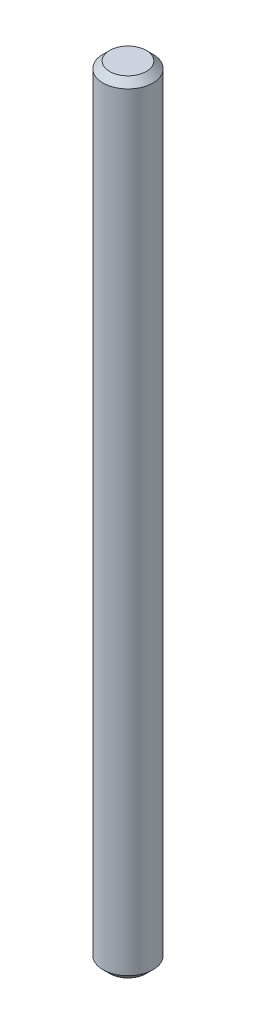
ISO-10303-21;
HEADER;
FILE_DESCRIPTION(('STEP AP214'),'2;1');
FILE_NAME('part.step','',(''),(''),'','','');
FILE_SCHEMA(('AUTOMOTIVE_DESIGN { 1 0 10303 214 1 1 1 1 }'));
ENDSEC;
DATA;
#1=APPLICATION_CONTEXT('core data for automotive mechanical design processes');
#2=APPLICATION_PROTOCOL_DEFINITION('international standard','automotive_design',2000,#1);
#3=PRODUCT_CONTEXT('',#1,'mechanical');
#4=PRODUCT('Part','Part','',(#3));
#5=PRODUCT_RELATED_PRODUCT_CATEGORY('part','',(#4));
#6=PRODUCT_DEFINITION_FORMATION('','',#4);
#7=PRODUCT_DEFINITION_CONTEXT('part definition',#1,'design');
#8=PRODUCT_DEFINITION('design','',#6,#7);
#9=PRODUCT_DEFINITION_SHAPE('','',#8);
#10=(LENGTH_UNIT() NAMED_UNIT(*) SI_UNIT(.MILLI.,.METRE.));
#11=(NAMED_UNIT(*) PLANE_ANGLE_UNIT() SI_UNIT($,.RADIAN.));
#12=(NAMED_UNIT(*) SI_UNIT($,.STERADIAN.) SOLID_ANGLE_UNIT());
#13=UNCERTAINTY_MEASURE_WITH_UNIT(LENGTH_MEASURE(1.E-05),#10,'distance_accuracy_value','');
#14=(GEOMETRIC_REPRESENTATION_CONTEXT(3) GLOBAL_UNCERTAINTY_ASSIGNED_CONTEXT((#13)) GLOBAL_UNIT_ASSIGNED_CONTEXT((#10,
#11,#12)) REPRESENTATION_CONTEXT('',''));
#15=CARTESIAN_POINT('',(0.,0.,0.));
#16=DIRECTION('',(0.,0.,1.));
#17=DIRECTION('',(1.,0.,0.));
#18=AXIS2_PLACEMENT_3D('',#15,#16,#17);
#19=CARTESIAN_POINT('',(0.,23.5,0.));
#20=DIRECTION('',(0.,-1.,0.));
#21=DIRECTION('',(0.,0.,-1.));
#22=AXIS2_PLACEMENT_3D('',#19,#20,#21);
#23=CYLINDRICAL_SURFACE('',#22,0.75);
#24=CARTESIAN_POINT('',(0.,23.3,0.));
#25=DIRECTION('',(0.,1.,0.));
#26=DIRECTION('',(0.,0.,1.));
#27=AXIS2_PLACEMENT_3D('',#24,#25,#26);
#28=CIRCLE('',#27,0.75);
#29=CARTESIAN_POINT('',(0.,23.3,0.75));
#30=VERTEX_POINT('',#29);
#31=EDGE_CURVE('E42',#30,#30,#28,.F.);
#32=ORIENTED_EDGE('',*,*,#31,.T.);
#33=EDGE_LOOP('',(#32));
#34=FACE_BOUND('',#33,.T.);
#35=CARTESIAN_POINT('',(0.,0.199999999999999,0.));
#36=DIRECTION('',(0.,1.,0.));
#37=DIRECTION('',(0.,0.,1.));
#38=AXIS2_PLACEMENT_3D('',#35,#36,#37);
#39=CIRCLE('',#38,0.75);
#40=CARTESIAN_POINT('',(0.,0.199999999999999,0.75));
#41=VERTEX_POINT('',#40);
#42=EDGE_CURVE('E46',#41,#41,#39,.T.);
#43=ORIENTED_EDGE('',*,*,#42,.T.);
#44=EDGE_LOOP('',(#43));
#45=FACE_BOUND('',#44,.T.);
#46=ADVANCED_FACE('F34',(#34,#45),#23,.T.);
#47=CARTESIAN_POINT('',(0.,23.5,0.));
#48=DIRECTION('',(0.,1.,0.));
#49=DIRECTION('',(0.,0.,1.));
#50=AXIS2_PLACEMENT_3D('',#47,#48,#49);
#51=PLANE('',#50);
#52=CARTESIAN_POINT('',(0.,23.5,0.));
#53=DIRECTION('',(0.,1.,0.));
#54=DIRECTION('',(0.,0.,1.));
#55=AXIS2_PLACEMENT_3D('',#52,#53,#54);
#56=CIRCLE('',#55,0.550000000000002);
#57=CARTESIAN_POINT('',(0.,23.5,0.550000000000002));
#58=VERTEX_POINT('',#57);
#59=EDGE_CURVE('E50',#58,#58,#56,.T.);
#60=ORIENTED_EDGE('',*,*,#59,.T.);
#61=EDGE_LOOP('',(#60));
#62=FACE_BOUND('',#61,.T.);
#63=ADVANCED_FACE('F56',(#62),#51,.T.);
#64=CARTESIAN_POINT('',(0.,0.,0.));
#65=DIRECTION('',(0.,1.,0.));
#66=DIRECTION('',(0.,0.,1.));
#67=AXIS2_PLACEMENT_3D('',#64,#65,#66);
#68=PLANE('',#67);
#69=CARTESIAN_POINT('',(0.,0.,0.));
#70=DIRECTION('',(0.,1.,0.));
#71=DIRECTION('',(0.,0.,1.));
#72=AXIS2_PLACEMENT_3D('',#69,#70,#71);
#73=CIRCLE('',#72,0.550000000000002);
#74=CARTESIAN_POINT('',(0.,0.,0.550000000000002));
#75=VERTEX_POINT('',#74);
#76=EDGE_CURVE('E10',#75,#75,#73,.F.);
#77=ORIENTED_EDGE('',*,*,#76,.T.);
#78=EDGE_LOOP('',(#77));
#79=FACE_BOUND('',#78,.T.);
#80=ADVANCED_FACE('F60',(#79),#68,.F.);
#81=CARTESIAN_POINT('',(0.,23.5,0.));
#82=DIRECTION('',(0.,-1.,0.));
#83=DIRECTION('',(0.,0.,-1.));
#84=AXIS2_PLACEMENT_3D('',#81,#82,#83);
#85=CONICAL_SURFACE('',#84,0.550000000000002,0.785398163397447);
#86=ORIENTED_EDGE('',*,*,#31,.F.);
#87=EDGE_LOOP('',(#86));
#88=FACE_BOUND('',#87,.T.);
#89=ORIENTED_EDGE('',*,*,#59,.F.);
#90=EDGE_LOOP('',(#89));
#91=FACE_BOUND('',#90,.T.);
#92=ADVANCED_FACE('F58',(#88,#91),#85,.T.);
#93=CARTESIAN_POINT('',(0.,0.199999999999999,0.));
#94=DIRECTION('',(0.,1.,0.));
#95=DIRECTION('',(0.,0.,1.));
#96=AXIS2_PLACEMENT_3D('',#93,#94,#95);
#97=CONICAL_SURFACE('',#96,0.75,0.785398163397447);
#98=ORIENTED_EDGE('',*,*,#76,.F.);
#99=EDGE_LOOP('',(#98));
#100=FACE_BOUND('',#99,.T.);
#101=ORIENTED_EDGE('',*,*,#42,.F.);
#102=EDGE_LOOP('',(#101));
#103=FACE_BOUND('',#102,.T.);
#104=ADVANCED_FACE('F37',(#100,#103),#97,.T.);
#105=CLOSED_SHELL('',(#46,#63,#80,#92,#104));
#106=MANIFOLD_SOLID_BREP('B2',#105);
#107=ADVANCED_BREP_SHAPE_REPRESENTATION('',(#18,#106),#14);
#108=SHAPE_DEFINITION_REPRESENTATION(#9,#107);
ENDSEC;
END-ISO-10303-21;
